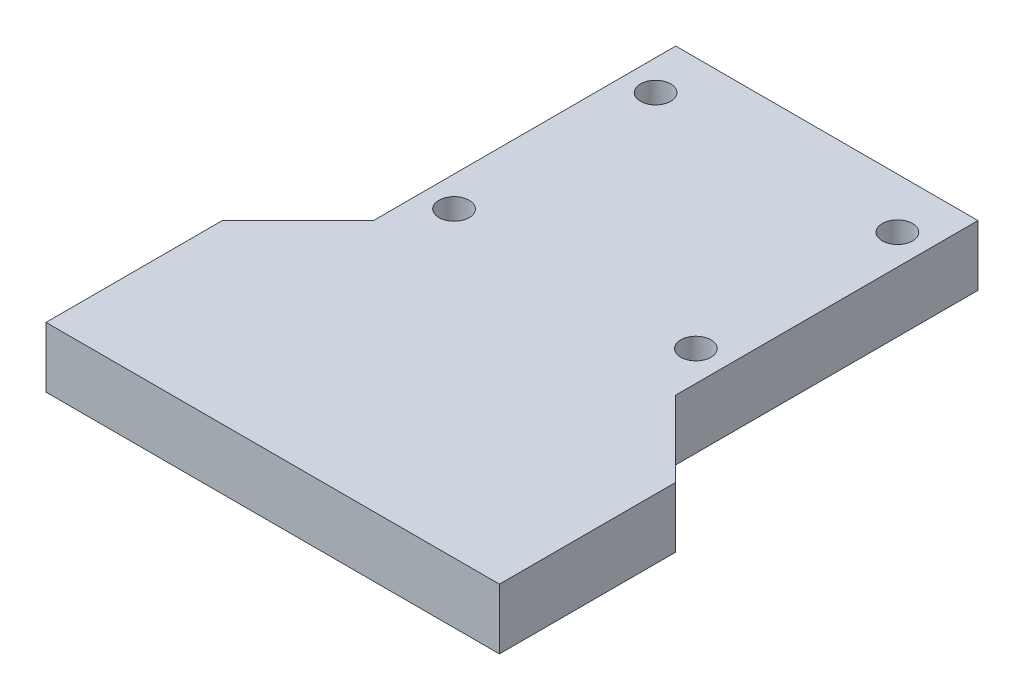
ISO-10303-21;
HEADER;
FILE_DESCRIPTION(('STEP AP214'),'2;1');
FILE_NAME('part.step','',(''),(''),'','','');
FILE_SCHEMA(('AUTOMOTIVE_DESIGN { 1 0 10303 214 1 1 1 1 }'));
ENDSEC;
DATA;
#1=APPLICATION_CONTEXT('core data for automotive mechanical design processes');
#2=APPLICATION_PROTOCOL_DEFINITION('international standard','automotive_design',2000,#1);
#3=PRODUCT_CONTEXT('',#1,'mechanical');
#4=PRODUCT('Part','Part','',(#3));
#5=PRODUCT_RELATED_PRODUCT_CATEGORY('part','',(#4));
#6=PRODUCT_DEFINITION_FORMATION('','',#4);
#7=PRODUCT_DEFINITION_CONTEXT('part definition',#1,'design');
#8=PRODUCT_DEFINITION('design','',#6,#7);
#9=PRODUCT_DEFINITION_SHAPE('','',#8);
#10=(LENGTH_UNIT() NAMED_UNIT(*) SI_UNIT(.MILLI.,.METRE.));
#11=(NAMED_UNIT(*) PLANE_ANGLE_UNIT() SI_UNIT($,.RADIAN.));
#12=(NAMED_UNIT(*) SI_UNIT($,.STERADIAN.) SOLID_ANGLE_UNIT());
#13=UNCERTAINTY_MEASURE_WITH_UNIT(LENGTH_MEASURE(1.E-05),#10,'distance_accuracy_value','');
#14=(GEOMETRIC_REPRESENTATION_CONTEXT(3) GLOBAL_UNCERTAINTY_ASSIGNED_CONTEXT((#13)) GLOBAL_UNIT_ASSIGNED_CONTEXT((#10,
#11,#12)) REPRESENTATION_CONTEXT('',''));
#15=CARTESIAN_POINT('',(0.,0.,0.));
#16=DIRECTION('',(0.,0.,1.));
#17=DIRECTION('',(1.,0.,0.));
#18=AXIS2_PLACEMENT_3D('',#15,#16,#17);
#19=CARTESIAN_POINT('',(45.0000000000001,12.,44.9999999999998));
#20=DIRECTION('',(-0.707106781186541,0.,0.707106781186554));
#21=DIRECTION('',(0.707106781186554,0.,0.707106781186541));
#22=AXIS2_PLACEMENT_3D('',#19,#20,#21);
#23=PLANE('',#22);
#24=DIRECTION('',(-0.707106781186554,0.,-0.707106781186541));
#25=VECTOR('',#24,1.);
#26=CARTESIAN_POINT('',(45.0000000000001,0.,44.9999999999998));
#27=LINE('',#26,#25);
#28=CARTESIAN_POINT('',(45.0000000000001,0.,44.9999999999998));
#29=VERTEX_POINT('',#28);
#30=CARTESIAN_POINT('',(30.,0.,30.));
#31=VERTEX_POINT('',#30);
#32=EDGE_CURVE('E127',#29,#31,#27,.T.);
#33=ORIENTED_EDGE('',*,*,#32,.T.);
#34=DIRECTION('',(0.,-1.,0.));
#35=VECTOR('',#34,1.);
#36=CARTESIAN_POINT('',(30.,12.,30.));
#37=LINE('',#36,#35);
#38=CARTESIAN_POINT('',(30.,12.,30.));
#39=VERTEX_POINT('',#38);
#40=EDGE_CURVE('E11',#39,#31,#37,.T.);
#41=ORIENTED_EDGE('',*,*,#40,.F.);
#42=DIRECTION('',(-0.707106781186554,0.,-0.707106781186541));
#43=VECTOR('',#42,1.);
#44=CARTESIAN_POINT('',(45.0000000000001,12.,44.9999999999998));
#45=LINE('',#44,#43);
#46=CARTESIAN_POINT('',(45.0000000000001,12.,44.9999999999998));
#47=VERTEX_POINT('',#46);
#48=EDGE_CURVE('E142',#47,#39,#45,.T.);
#49=ORIENTED_EDGE('',*,*,#48,.F.);
#50=DIRECTION('',(0.,-1.,0.));
#51=VECTOR('',#50,1.);
#52=CARTESIAN_POINT('',(45.0000000000001,12.,44.9999999999998));
#53=LINE('',#52,#51);
#54=EDGE_CURVE('E123',#47,#29,#53,.T.);
#55=ORIENTED_EDGE('',*,*,#54,.T.);
#56=EDGE_LOOP('',(#33,#41,#49,#55));
#57=FACE_BOUND('',#56,.T.);
#58=ADVANCED_FACE('F31',(#57),#23,.F.);
#59=CARTESIAN_POINT('',(30.,12.,-30.));
#60=DIRECTION('',(-1.,0.,0.));
#61=DIRECTION('',(0.,0.,1.));
#62=AXIS2_PLACEMENT_3D('',#59,#60,#61);
#63=PLANE('',#62);
#64=DIRECTION('',(0.,0.,-1.));
#65=VECTOR('',#64,1.);
#66=CARTESIAN_POINT('',(30.,0.,-30.));
#67=LINE('',#66,#65);
#68=CARTESIAN_POINT('',(30.,0.,-30.));
#69=VERTEX_POINT('',#68);
#70=EDGE_CURVE('E130',#31,#69,#67,.T.);
#71=ORIENTED_EDGE('',*,*,#70,.T.);
#72=DIRECTION('',(0.,-1.,0.));
#73=VECTOR('',#72,1.);
#74=CARTESIAN_POINT('',(30.,12.,-30.));
#75=LINE('',#74,#73);
#76=CARTESIAN_POINT('',(30.,12.,-30.));
#77=VERTEX_POINT('',#76);
#78=EDGE_CURVE('E39',#77,#69,#75,.T.);
#79=ORIENTED_EDGE('',*,*,#78,.F.);
#80=DIRECTION('',(0.,0.,-1.));
#81=VECTOR('',#80,1.);
#82=CARTESIAN_POINT('',(30.,12.,-30.));
#83=LINE('',#82,#81);
#84=EDGE_CURVE('E90',#39,#77,#83,.T.);
#85=ORIENTED_EDGE('',*,*,#84,.F.);
#86=ORIENTED_EDGE('',*,*,#40,.T.);
#87=EDGE_LOOP('',(#71,#79,#85,#86));
#88=FACE_BOUND('',#87,.T.);
#89=ADVANCED_FACE('F228',(#88),#63,.F.);
#90=CARTESIAN_POINT('',(-30.,12.,-30.));
#91=DIRECTION('',(0.,0.,1.));
#92=DIRECTION('',(1.,0.,0.));
#93=AXIS2_PLACEMENT_3D('',#90,#91,#92);
#94=PLANE('',#93);
#95=DIRECTION('',(-1.,0.,0.));
#96=VECTOR('',#95,1.);
#97=CARTESIAN_POINT('',(-30.,0.,-30.));
#98=LINE('',#97,#96);
#99=CARTESIAN_POINT('',(-30.,0.,-30.));
#100=VERTEX_POINT('',#99);
#101=EDGE_CURVE('E133',#69,#100,#98,.T.);
#102=ORIENTED_EDGE('',*,*,#101,.T.);
#103=DIRECTION('',(0.,-1.,0.));
#104=VECTOR('',#103,1.);
#105=CARTESIAN_POINT('',(-30.,12.,-30.));
#106=LINE('',#105,#104);
#107=CARTESIAN_POINT('',(-30.,12.,-30.));
#108=VERTEX_POINT('',#107);
#109=EDGE_CURVE('E149',#108,#100,#106,.T.);
#110=ORIENTED_EDGE('',*,*,#109,.F.);
#111=DIRECTION('',(-1.,0.,0.));
#112=VECTOR('',#111,1.);
#113=CARTESIAN_POINT('',(-30.,12.,-30.));
#114=LINE('',#113,#112);
#115=EDGE_CURVE('E157',#77,#108,#114,.T.);
#116=ORIENTED_EDGE('',*,*,#115,.F.);
#117=ORIENTED_EDGE('',*,*,#78,.T.);
#118=EDGE_LOOP('',(#102,#110,#116,#117));
#119=FACE_BOUND('',#118,.T.);
#120=ADVANCED_FACE('F155',(#119),#94,.F.);
#121=CARTESIAN_POINT('',(-30.,12.,-30.));
#122=DIRECTION('',(1.,0.,0.));
#123=DIRECTION('',(0.,0.,-1.));
#124=AXIS2_PLACEMENT_3D('',#121,#122,#123);
#125=PLANE('',#124);
#126=DIRECTION('',(0.,0.,1.));
#127=VECTOR('',#126,1.);
#128=CARTESIAN_POINT('',(-30.,0.,-30.));
#129=LINE('',#128,#127);
#130=CARTESIAN_POINT('',(-30.,0.,30.));
#131=VERTEX_POINT('',#130);
#132=EDGE_CURVE('E135',#100,#131,#129,.T.);
#133=ORIENTED_EDGE('',*,*,#132,.T.);
#134=DIRECTION('',(0.,-1.,0.));
#135=VECTOR('',#134,1.);
#136=CARTESIAN_POINT('',(-30.,12.,30.));
#137=LINE('',#136,#135);
#138=CARTESIAN_POINT('',(-30.,12.,30.));
#139=VERTEX_POINT('',#138);
#140=EDGE_CURVE('E146',#139,#131,#137,.T.);
#141=ORIENTED_EDGE('',*,*,#140,.F.);
#142=DIRECTION('',(0.,0.,1.));
#143=VECTOR('',#142,1.);
#144=CARTESIAN_POINT('',(-30.,12.,-30.));
#145=LINE('',#144,#143);
#146=EDGE_CURVE('E169',#108,#139,#145,.T.);
#147=ORIENTED_EDGE('',*,*,#146,.F.);
#148=ORIENTED_EDGE('',*,*,#109,.T.);
#149=EDGE_LOOP('',(#133,#141,#147,#148));
#150=FACE_BOUND('',#149,.T.);
#151=ADVANCED_FACE('F165',(#150),#125,.F.);
#152=CARTESIAN_POINT('',(-30.,12.,30.));
#153=DIRECTION('',(0.707106781186547,0.,0.707106781186548));
#154=DIRECTION('',(0.707106781186548,0.,-0.707106781186547));
#155=AXIS2_PLACEMENT_3D('',#152,#153,#154);
#156=PLANE('',#155);
#157=DIRECTION('',(-0.707106781186548,0.,0.707106781186547));
#158=VECTOR('',#157,1.);
#159=CARTESIAN_POINT('',(-30.,0.,30.));
#160=LINE('',#159,#158);
#161=CARTESIAN_POINT('',(-44.9999999999999,0.,44.9999999999998));
#162=VERTEX_POINT('',#161);
#163=EDGE_CURVE('E137',#131,#162,#160,.T.);
#164=ORIENTED_EDGE('',*,*,#163,.T.);
#165=DIRECTION('',(0.,-1.,0.));
#166=VECTOR('',#165,1.);
#167=CARTESIAN_POINT('',(-44.9999999999999,12.,44.9999999999998));
#168=LINE('',#167,#166);
#169=CARTESIAN_POINT('',(-44.9999999999999,12.,44.9999999999998));
#170=VERTEX_POINT('',#169);
#171=EDGE_CURVE('E118',#170,#162,#168,.T.);
#172=ORIENTED_EDGE('',*,*,#171,.F.);
#173=DIRECTION('',(-0.707106781186548,0.,0.707106781186547));
#174=VECTOR('',#173,1.);
#175=CARTESIAN_POINT('',(-30.,12.,30.));
#176=LINE('',#175,#174);
#177=EDGE_CURVE('E109',#139,#170,#176,.T.);
#178=ORIENTED_EDGE('',*,*,#177,.F.);
#179=ORIENTED_EDGE('',*,*,#140,.T.);
#180=EDGE_LOOP('',(#164,#172,#178,#179));
#181=FACE_BOUND('',#180,.T.);
#182=ADVANCED_FACE('F168',(#181),#156,.F.);
#183=CARTESIAN_POINT('',(-44.9999999999999,12.,44.9999999999998));
#184=DIRECTION('',(1.,0.,0.));
#185=DIRECTION('',(0.,0.,-1.));
#186=AXIS2_PLACEMENT_3D('',#183,#184,#185);
#187=PLANE('',#186);
#188=DIRECTION('',(0.,0.,1.));
#189=VECTOR('',#188,1.);
#190=CARTESIAN_POINT('',(-44.9999999999999,0.,44.9999999999998));
#191=LINE('',#190,#189);
#192=CARTESIAN_POINT('',(-44.9999999999999,0.,80.));
#193=VERTEX_POINT('',#192);
#194=EDGE_CURVE('E117',#162,#193,#191,.T.);
#195=ORIENTED_EDGE('',*,*,#194,.T.);
#196=DIRECTION('',(0.,-1.,0.));
#197=VECTOR('',#196,1.);
#198=CARTESIAN_POINT('',(-44.9999999999999,12.,80.));
#199=LINE('',#198,#197);
#200=CARTESIAN_POINT('',(-44.9999999999999,12.,80.));
#201=VERTEX_POINT('',#200);
#202=EDGE_CURVE('E114',#201,#193,#199,.T.);
#203=ORIENTED_EDGE('',*,*,#202,.F.);
#204=DIRECTION('',(0.,0.,1.));
#205=VECTOR('',#204,1.);
#206=CARTESIAN_POINT('',(-44.9999999999999,12.,44.9999999999998));
#207=LINE('',#206,#205);
#208=EDGE_CURVE('E103',#170,#201,#207,.T.);
#209=ORIENTED_EDGE('',*,*,#208,.F.);
#210=ORIENTED_EDGE('',*,*,#171,.T.);
#211=EDGE_LOOP('',(#195,#203,#209,#210));
#212=FACE_BOUND('',#211,.T.);
#213=ADVANCED_FACE('F115',(#212),#187,.F.);
#214=CARTESIAN_POINT('',(-44.9999999999999,12.,80.));
#215=DIRECTION('',(0.,0.,-1.));
#216=DIRECTION('',(-1.,0.,0.));
#217=AXIS2_PLACEMENT_3D('',#214,#215,#216);
#218=PLANE('',#217);
#219=DIRECTION('',(1.,0.,0.));
#220=VECTOR('',#219,1.);
#221=CARTESIAN_POINT('',(-44.9999999999999,0.,80.));
#222=LINE('',#221,#220);
#223=CARTESIAN_POINT('',(45.0000000000001,0.,80.));
#224=VERTEX_POINT('',#223);
#225=EDGE_CURVE('E76',#193,#224,#222,.T.);
#226=ORIENTED_EDGE('',*,*,#225,.T.);
#227=DIRECTION('',(0.,-1.,0.));
#228=VECTOR('',#227,1.);
#229=CARTESIAN_POINT('',(45.0000000000001,12.,80.));
#230=LINE('',#229,#228);
#231=CARTESIAN_POINT('',(45.0000000000001,12.,80.));
#232=VERTEX_POINT('',#231);
#233=EDGE_CURVE('E119',#232,#224,#230,.T.);
#234=ORIENTED_EDGE('',*,*,#233,.F.);
#235=DIRECTION('',(1.,0.,0.));
#236=VECTOR('',#235,1.);
#237=CARTESIAN_POINT('',(-44.9999999999999,12.,80.));
#238=LINE('',#237,#236);
#239=EDGE_CURVE('E107',#201,#232,#238,.T.);
#240=ORIENTED_EDGE('',*,*,#239,.F.);
#241=ORIENTED_EDGE('',*,*,#202,.T.);
#242=EDGE_LOOP('',(#226,#234,#240,#241));
#243=FACE_BOUND('',#242,.T.);
#244=ADVANCED_FACE('F121',(#243),#218,.F.);
#245=CARTESIAN_POINT('',(45.0000000000001,12.,80.));
#246=DIRECTION('',(-1.,0.,0.));
#247=DIRECTION('',(0.,0.,1.));
#248=AXIS2_PLACEMENT_3D('',#245,#246,#247);
#249=PLANE('',#248);
#250=DIRECTION('',(0.,0.,-1.));
#251=VECTOR('',#250,1.);
#252=CARTESIAN_POINT('',(45.0000000000001,0.,80.));
#253=LINE('',#252,#251);
#254=EDGE_CURVE('E82',#224,#29,#253,.T.);
#255=ORIENTED_EDGE('',*,*,#254,.T.);
#256=ORIENTED_EDGE('',*,*,#54,.F.);
#257=DIRECTION('',(0.,0.,-1.));
#258=VECTOR('',#257,1.);
#259=CARTESIAN_POINT('',(45.0000000000001,12.,80.));
#260=LINE('',#259,#258);
#261=EDGE_CURVE('E47',#232,#47,#260,.T.);
#262=ORIENTED_EDGE('',*,*,#261,.F.);
#263=ORIENTED_EDGE('',*,*,#233,.T.);
#264=EDGE_LOOP('',(#255,#256,#262,#263));
#265=FACE_BOUND('',#264,.T.);
#266=ADVANCED_FACE('F204',(#265),#249,.F.);
#267=CARTESIAN_POINT('',(-2.60208521396521E-13,12.,3.33066907387547E-13));
#268=DIRECTION('',(0.,1.,0.));
#269=DIRECTION('',(0.,0.,1.));
#270=AXIS2_PLACEMENT_3D('',#267,#268,#269);
#271=PLANE('',#270);
#272=CARTESIAN_POINT('',(24.,12.,20.));
#273=DIRECTION('',(0.,1.,0.));
#274=DIRECTION('',(0.,0.,1.));
#275=AXIS2_PLACEMENT_3D('',#272,#273,#274);
#276=CIRCLE('',#275,2.99999999999999);
#277=CARTESIAN_POINT('',(24.,12.,23.));
#278=VERTEX_POINT('',#277);
#279=EDGE_CURVE('E195',#278,#278,#276,.T.);
#280=ORIENTED_EDGE('',*,*,#279,.F.);
#281=EDGE_LOOP('',(#280));
#282=FACE_BOUND('',#281,.T.);
#283=CARTESIAN_POINT('',(24.,12.,-20.));
#284=DIRECTION('',(0.,1.,0.));
#285=DIRECTION('',(0.,0.,1.));
#286=AXIS2_PLACEMENT_3D('',#283,#284,#285);
#287=CIRCLE('',#286,3.);
#288=CARTESIAN_POINT('',(24.,12.,-17.));
#289=VERTEX_POINT('',#288);
#290=EDGE_CURVE('E189',#289,#289,#287,.T.);
#291=ORIENTED_EDGE('',*,*,#290,.F.);
#292=EDGE_LOOP('',(#291));
#293=FACE_BOUND('',#292,.T.);
#294=CARTESIAN_POINT('',(-24.,12.,20.));
#295=DIRECTION('',(0.,1.,0.));
#296=DIRECTION('',(0.,0.,1.));
#297=AXIS2_PLACEMENT_3D('',#294,#295,#296);
#298=CIRCLE('',#297,3.);
#299=CARTESIAN_POINT('',(-24.,12.,23.));
#300=VERTEX_POINT('',#299);
#301=EDGE_CURVE('E183',#300,#300,#298,.T.);
#302=ORIENTED_EDGE('',*,*,#301,.F.);
#303=EDGE_LOOP('',(#302));
#304=FACE_BOUND('',#303,.T.);
#305=CARTESIAN_POINT('',(-24.,12.,-20.));
#306=DIRECTION('',(0.,1.,0.));
#307=DIRECTION('',(0.,0.,1.));
#308=AXIS2_PLACEMENT_3D('',#305,#306,#307);
#309=CIRCLE('',#308,2.99999999999999);
#310=CARTESIAN_POINT('',(-24.,12.,-17.));
#311=VERTEX_POINT('',#310);
#312=EDGE_CURVE('E177',#311,#311,#309,.T.);
#313=ORIENTED_EDGE('',*,*,#312,.F.);
#314=EDGE_LOOP('',(#313));
#315=FACE_BOUND('',#314,.T.);
#316=ORIENTED_EDGE('',*,*,#48,.T.);
#317=ORIENTED_EDGE('',*,*,#84,.T.);
#318=ORIENTED_EDGE('',*,*,#115,.T.);
#319=ORIENTED_EDGE('',*,*,#146,.T.);
#320=ORIENTED_EDGE('',*,*,#177,.T.);
#321=ORIENTED_EDGE('',*,*,#208,.T.);
#322=ORIENTED_EDGE('',*,*,#239,.T.);
#323=ORIENTED_EDGE('',*,*,#261,.T.);
#324=EDGE_LOOP('',(#316,#317,#318,#319,#320,#321,#322,#323));
#325=FACE_BOUND('',#324,.T.);
#326=ADVANCED_FACE('F105',(#282,#293,#304,#315,#325),#271,.T.);
#327=CARTESIAN_POINT('',(-2.60208521396521E-13,0.,3.33066907387547E-13));
#328=DIRECTION('',(0.,1.,0.));
#329=DIRECTION('',(0.,0.,1.));
#330=AXIS2_PLACEMENT_3D('',#327,#328,#329);
#331=PLANE('',#330);
#332=CARTESIAN_POINT('',(24.,0.,20.));
#333=DIRECTION('',(0.,1.,0.));
#334=DIRECTION('',(0.,0.,1.));
#335=AXIS2_PLACEMENT_3D('',#332,#333,#334);
#336=CIRCLE('',#335,2.99999999999999);
#337=CARTESIAN_POINT('',(24.,0.,23.));
#338=VERTEX_POINT('',#337);
#339=EDGE_CURVE('E192',#338,#338,#336,.F.);
#340=ORIENTED_EDGE('',*,*,#339,.F.);
#341=EDGE_LOOP('',(#340));
#342=FACE_BOUND('',#341,.T.);
#343=CARTESIAN_POINT('',(24.,0.,-20.));
#344=DIRECTION('',(0.,1.,0.));
#345=DIRECTION('',(0.,0.,1.));
#346=AXIS2_PLACEMENT_3D('',#343,#344,#345);
#347=CIRCLE('',#346,3.);
#348=CARTESIAN_POINT('',(24.,0.,-17.));
#349=VERTEX_POINT('',#348);
#350=EDGE_CURVE('E186',#349,#349,#347,.F.);
#351=ORIENTED_EDGE('',*,*,#350,.F.);
#352=EDGE_LOOP('',(#351));
#353=FACE_BOUND('',#352,.T.);
#354=CARTESIAN_POINT('',(-24.,0.,20.));
#355=DIRECTION('',(0.,1.,0.));
#356=DIRECTION('',(0.,0.,1.));
#357=AXIS2_PLACEMENT_3D('',#354,#355,#356);
#358=CIRCLE('',#357,3.);
#359=CARTESIAN_POINT('',(-24.,0.,23.));
#360=VERTEX_POINT('',#359);
#361=EDGE_CURVE('E180',#360,#360,#358,.F.);
#362=ORIENTED_EDGE('',*,*,#361,.F.);
#363=EDGE_LOOP('',(#362));
#364=FACE_BOUND('',#363,.T.);
#365=CARTESIAN_POINT('',(-24.,0.,-20.));
#366=DIRECTION('',(0.,1.,0.));
#367=DIRECTION('',(0.,0.,1.));
#368=AXIS2_PLACEMENT_3D('',#365,#366,#367);
#369=CIRCLE('',#368,2.99999999999999);
#370=CARTESIAN_POINT('',(-24.,0.,-17.));
#371=VERTEX_POINT('',#370);
#372=EDGE_CURVE('E131',#371,#371,#369,.F.);
#373=ORIENTED_EDGE('',*,*,#372,.F.);
#374=EDGE_LOOP('',(#373));
#375=FACE_BOUND('',#374,.T.);
#376=ORIENTED_EDGE('',*,*,#32,.F.);
#377=ORIENTED_EDGE('',*,*,#254,.F.);
#378=ORIENTED_EDGE('',*,*,#225,.F.);
#379=ORIENTED_EDGE('',*,*,#194,.F.);
#380=ORIENTED_EDGE('',*,*,#163,.F.);
#381=ORIENTED_EDGE('',*,*,#132,.F.);
#382=ORIENTED_EDGE('',*,*,#101,.F.);
#383=ORIENTED_EDGE('',*,*,#70,.F.);
#384=EDGE_LOOP('',(#376,#377,#378,#379,#380,#381,#382,#383));
#385=FACE_BOUND('',#384,.T.);
#386=ADVANCED_FACE('F161',(#342,#353,#364,#375,#385),#331,.F.);
#387=CARTESIAN_POINT('',(-24.,-0.000999999999999265,-20.));
#388=DIRECTION('',(0.,1.,0.));
#389=DIRECTION('',(0.,0.,1.));
#390=AXIS2_PLACEMENT_3D('',#387,#388,#389);
#391=CYLINDRICAL_SURFACE('',#390,2.99999999999999);
#392=ORIENTED_EDGE('',*,*,#312,.T.);
#393=EDGE_LOOP('',(#392));
#394=FACE_BOUND('',#393,.T.);
#395=ORIENTED_EDGE('',*,*,#372,.T.);
#396=EDGE_LOOP('',(#395));
#397=FACE_BOUND('',#396,.T.);
#398=ADVANCED_FACE('F212',(#394,#397),#391,.F.);
#399=CARTESIAN_POINT('',(-24.,-0.000999999999999265,20.));
#400=DIRECTION('',(0.,1.,0.));
#401=DIRECTION('',(0.,0.,1.));
#402=AXIS2_PLACEMENT_3D('',#399,#400,#401);
#403=CYLINDRICAL_SURFACE('',#402,3.);
#404=ORIENTED_EDGE('',*,*,#301,.T.);
#405=EDGE_LOOP('',(#404));
#406=FACE_BOUND('',#405,.T.);
#407=ORIENTED_EDGE('',*,*,#361,.T.);
#408=EDGE_LOOP('',(#407));
#409=FACE_BOUND('',#408,.T.);
#410=ADVANCED_FACE('F215',(#406,#409),#403,.F.);
#411=CARTESIAN_POINT('',(24.,-0.000999999999999265,-20.));
#412=DIRECTION('',(0.,1.,0.));
#413=DIRECTION('',(0.,0.,1.));
#414=AXIS2_PLACEMENT_3D('',#411,#412,#413);
#415=CYLINDRICAL_SURFACE('',#414,3.);
#416=ORIENTED_EDGE('',*,*,#290,.T.);
#417=EDGE_LOOP('',(#416));
#418=FACE_BOUND('',#417,.T.);
#419=ORIENTED_EDGE('',*,*,#350,.T.);
#420=EDGE_LOOP('',(#419));
#421=FACE_BOUND('',#420,.T.);
#422=ADVANCED_FACE('F297',(#418,#421),#415,.F.);
#423=CARTESIAN_POINT('',(24.,-0.000999999999999265,20.));
#424=DIRECTION('',(0.,1.,0.));
#425=DIRECTION('',(0.,0.,1.));
#426=AXIS2_PLACEMENT_3D('',#423,#424,#425);
#427=CYLINDRICAL_SURFACE('',#426,2.99999999999999);
#428=ORIENTED_EDGE('',*,*,#279,.T.);
#429=EDGE_LOOP('',(#428));
#430=FACE_BOUND('',#429,.T.);
#431=ORIENTED_EDGE('',*,*,#339,.T.);
#432=EDGE_LOOP('',(#431));
#433=FACE_BOUND('',#432,.T.);
#434=ADVANCED_FACE('F199',(#430,#433),#427,.F.);
#435=CLOSED_SHELL('',(#58,#89,#120,#151,#182,#213,#244,#266,#326,#386,#398,#410,#422,#434));
#436=MANIFOLD_SOLID_BREP('B2',#435);
#437=ADVANCED_BREP_SHAPE_REPRESENTATION('',(#18,#436),#14);
#438=SHAPE_DEFINITION_REPRESENTATION(#9,#437);
ENDSEC;
END-ISO-10303-21;
